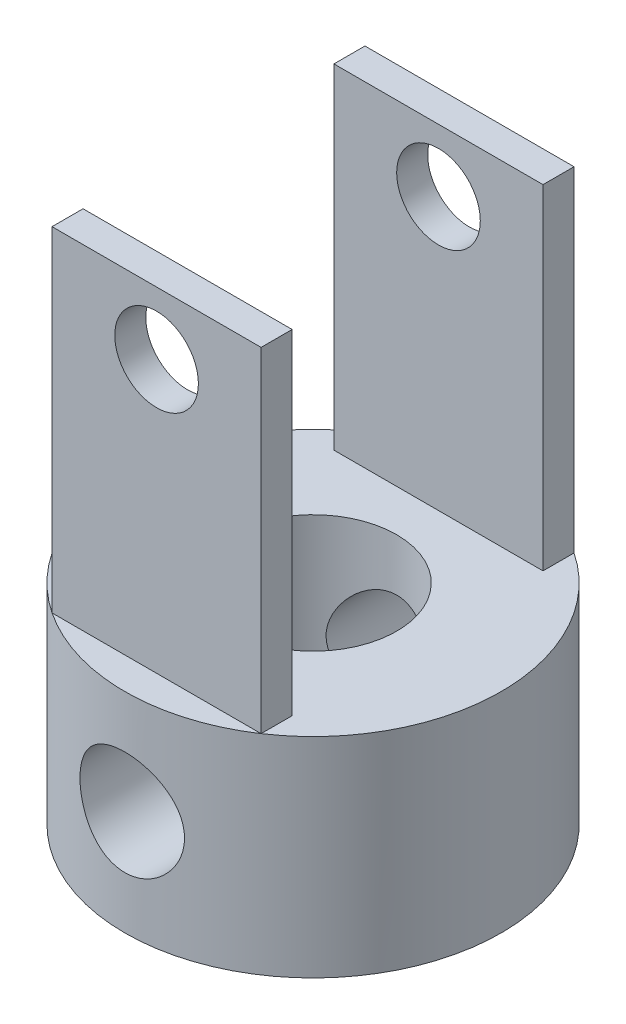
ISO-10303-21;
HEADER;
FILE_DESCRIPTION(('STEP AP214'),'2;1');
FILE_NAME('part.step','',(''),(''),'','','');
FILE_SCHEMA(('AUTOMOTIVE_DESIGN { 1 0 10303 214 1 1 1 1 }'));
ENDSEC;
DATA;
#1=APPLICATION_CONTEXT('core data for automotive mechanical design processes');
#2=APPLICATION_PROTOCOL_DEFINITION('international standard','automotive_design',2000,#1);
#3=PRODUCT_CONTEXT('',#1,'mechanical');
#4=PRODUCT('Part','Part','',(#3));
#5=PRODUCT_RELATED_PRODUCT_CATEGORY('part','',(#4));
#6=PRODUCT_DEFINITION_FORMATION('','',#4);
#7=PRODUCT_DEFINITION_CONTEXT('part definition',#1,'design');
#8=PRODUCT_DEFINITION('design','',#6,#7);
#9=PRODUCT_DEFINITION_SHAPE('','',#8);
#10=(LENGTH_UNIT() NAMED_UNIT(*) SI_UNIT(.MILLI.,.METRE.));
#11=(NAMED_UNIT(*) PLANE_ANGLE_UNIT() SI_UNIT($,.RADIAN.));
#12=(NAMED_UNIT(*) SI_UNIT($,.STERADIAN.) SOLID_ANGLE_UNIT());
#13=UNCERTAINTY_MEASURE_WITH_UNIT(LENGTH_MEASURE(1.E-05),#10,'distance_accuracy_value','');
#14=(GEOMETRIC_REPRESENTATION_CONTEXT(3) GLOBAL_UNCERTAINTY_ASSIGNED_CONTEXT((#13)) GLOBAL_UNIT_ASSIGNED_CONTEXT((#10,
#11,#12)) REPRESENTATION_CONTEXT('',''));
#15=CARTESIAN_POINT('',(0.,0.,0.));
#16=DIRECTION('',(0.,0.,1.));
#17=DIRECTION('',(1.,0.,0.));
#18=AXIS2_PLACEMENT_3D('',#15,#16,#17);
#19=CARTESIAN_POINT('',(0.,5.,0.));
#20=DIRECTION('',(0.,1.,0.));
#21=DIRECTION('',(0.,0.,1.));
#22=AXIS2_PLACEMENT_3D('',#19,#20,#21);
#23=PLANE('',#22);
#24=CARTESIAN_POINT('',(0.,5.,0.));
#25=DIRECTION('',(0.,1.,0.));
#26=DIRECTION('',(0.,0.,1.));
#27=AXIS2_PLACEMENT_3D('',#24,#25,#26);
#28=CIRCLE('',#27,2.);
#29=CARTESIAN_POINT('',(0.,5.,2.));
#30=VERTEX_POINT('',#29);
#31=EDGE_CURVE('E225',#30,#30,#28,.F.);
#32=ORIENTED_EDGE('',*,*,#31,.T.);
#33=EDGE_LOOP('',(#32));
#34=FACE_BOUND('',#33,.T.);
#35=DIRECTION('',(0.,0.,1.));
#36=VECTOR('',#35,1.);
#37=CARTESIAN_POINT('',(-2.5,5.,-3.74165738677394));
#38=LINE('',#37,#36);
#39=CARTESIAN_POINT('',(-2.5,5.,-3.74165738677394));
#40=VERTEX_POINT('',#39);
#41=CARTESIAN_POINT('',(-2.5,5.,-3.));
#42=VERTEX_POINT('',#41);
#43=EDGE_CURVE('E137',#40,#42,#38,.T.);
#44=ORIENTED_EDGE('',*,*,#43,.F.);
#45=CARTESIAN_POINT('',(0.,5.,0.));
#46=DIRECTION('',(0.,1.,0.));
#47=DIRECTION('',(0.,0.,1.));
#48=AXIS2_PLACEMENT_3D('',#45,#46,#47);
#49=CIRCLE('',#48,4.5);
#50=CARTESIAN_POINT('',(-2.5,5.,3.74165738677394));
#51=VERTEX_POINT('',#50);
#52=EDGE_CURVE('E313',#40,#51,#49,.T.);
#53=ORIENTED_EDGE('',*,*,#52,.T.);
#54=DIRECTION('',(0.,0.,1.));
#55=VECTOR('',#54,1.);
#56=CARTESIAN_POINT('',(-2.5,5.,3.74165738677394));
#57=LINE('',#56,#55);
#58=CARTESIAN_POINT('',(-2.5,5.,3.));
#59=VERTEX_POINT('',#58);
#60=EDGE_CURVE('E72',#59,#51,#57,.T.);
#61=ORIENTED_EDGE('',*,*,#60,.F.);
#62=DIRECTION('',(-1.,0.,0.));
#63=VECTOR('',#62,1.);
#64=CARTESIAN_POINT('',(-2.5,5.,3.));
#65=LINE('',#64,#63);
#66=CARTESIAN_POINT('',(2.5,5.,3.));
#67=VERTEX_POINT('',#66);
#68=EDGE_CURVE('E158',#67,#59,#65,.T.);
#69=ORIENTED_EDGE('',*,*,#68,.F.);
#70=DIRECTION('',(0.,0.,-1.));
#71=VECTOR('',#70,1.);
#72=CARTESIAN_POINT('',(2.5,5.,3.74165738677394));
#73=LINE('',#72,#71);
#74=CARTESIAN_POINT('',(2.5,5.,3.74165738677394));
#75=VERTEX_POINT('',#74);
#76=EDGE_CURVE('E160',#75,#67,#73,.T.);
#77=ORIENTED_EDGE('',*,*,#76,.F.);
#78=CARTESIAN_POINT('',(2.5,5.,-3.74165738677394));
#79=VERTEX_POINT('',#78);
#80=EDGE_CURVE('E11',#75,#79,#49,.T.);
#81=ORIENTED_EDGE('',*,*,#80,.T.);
#82=DIRECTION('',(0.,0.,-1.));
#83=VECTOR('',#82,1.);
#84=CARTESIAN_POINT('',(2.5,5.,-3.74165738677394));
#85=LINE('',#84,#83);
#86=CARTESIAN_POINT('',(2.5,5.,-3.));
#87=VERTEX_POINT('',#86);
#88=EDGE_CURVE('E193',#87,#79,#85,.T.);
#89=ORIENTED_EDGE('',*,*,#88,.F.);
#90=DIRECTION('',(1.,0.,0.));
#91=VECTOR('',#90,1.);
#92=CARTESIAN_POINT('',(-2.5,5.,-3.));
#93=LINE('',#92,#91);
#94=EDGE_CURVE('E65',#42,#87,#93,.T.);
#95=ORIENTED_EDGE('',*,*,#94,.F.);
#96=EDGE_LOOP('',(#44,#53,#61,#69,#77,#81,#89,#95));
#97=FACE_BOUND('',#96,.T.);
#98=ADVANCED_FACE('F47',(#34,#97),#23,.T.);
#99=DIRECTION('',(-1.,0.,0.));
#100=VECTOR('',#99,1.);
#101=CARTESIAN_POINT('',(-2.5,5.,-3.74165738677394));
#102=LINE('',#101,#100);
#103=EDGE_CURVE('E134',#79,#40,#102,.T.);
#104=ORIENTED_EDGE('',*,*,#103,.F.);
#105=EDGE_CURVE('E57',#79,#40,#49,.T.);
#106=ORIENTED_EDGE('',*,*,#105,.T.);
#107=EDGE_LOOP('',(#104,#106));
#108=FACE_BOUND('',#107,.T.);
#109=ADVANCED_FACE('F290',(#108),#23,.T.);
#110=CARTESIAN_POINT('',(0.,5.,0.));
#111=DIRECTION('',(0.,-1.,0.));
#112=DIRECTION('',(0.,0.,-1.));
#113=AXIS2_PLACEMENT_3D('',#110,#111,#112);
#114=CYLINDRICAL_SURFACE('',#113,4.5);
#115=CARTESIAN_POINT('',(0.,3.75,-4.5));
#116=CARTESIAN_POINT('',(-0.0688012508831791,3.74999860041477,-4.49999908016929));
#117=CARTESIAN_POINT('',(-0.137617123752667,3.74430068019471,-4.49840674086833));
#118=CARTESIAN_POINT('',(-0.273259475994238,3.72170427173468,-4.49220950198236));
#119=CARTESIAN_POINT('',(-0.340085103663439,3.70480105828628,-4.48760333149253));
#120=CARTESIAN_POINT('',(-0.469769949680301,3.66039128058608,-4.47588565394594));
#121=CARTESIAN_POINT('',(-0.53263439009567,3.63289903130159,-4.46877753030964));
#122=CARTESIAN_POINT('',(-0.652860695241772,3.56814649367313,-4.45280312581996));
#123=CARTESIAN_POINT('',(-0.710222070812297,3.53088533808074,-4.44393668888688));
#124=CARTESIAN_POINT('',(-0.819246784715924,3.44667056615714,-4.4251515781749));
#125=CARTESIAN_POINT('',(-0.870753112808474,3.39951796031246,-4.41521373623696));
#126=CARTESIAN_POINT('',(-0.965238185696338,3.29728372287841,-4.39552607117256));
#127=CARTESIAN_POINT('',(-1.00821573084554,3.24220097772477,-4.38577627467018));
#128=CARTESIAN_POINT('',(-1.08520808580323,3.12439273987068,-4.36737044294547));
#129=CARTESIAN_POINT('',(-1.11903874947837,3.06154279155628,-4.35873847945984));
#130=CARTESIAN_POINT('',(-1.1755895713114,2.93076808235988,-4.34382900808304));
#131=CARTESIAN_POINT('',(-1.19831197336242,2.86284434959184,-4.33755102474248));
#132=CARTESIAN_POINT('',(-1.23144924367956,2.72559721114588,-4.32825883142877));
#133=CARTESIAN_POINT('',(-1.24215036904296,2.65634817836012,-4.32516886003198));
#134=CARTESIAN_POINT('',(-1.25183427077972,2.51697411443717,-4.32237649384804));
#135=CARTESIAN_POINT('',(-1.25081944027303,2.4468492651188,-4.3226734072502));
#136=CARTESIAN_POINT('',(-1.2373267133762,2.30997772127729,-4.32655366801453));
#137=CARTESIAN_POINT('',(-1.22519902270671,2.24319319850379,-4.33003660668585));
#138=CARTESIAN_POINT('',(-1.19038731201905,2.11264637140841,-4.33973517053475));
#139=CARTESIAN_POINT('',(-1.16770238457158,2.04888432739775,-4.3459510306134));
#140=CARTESIAN_POINT('',(-1.11214373134465,1.92529776854472,-4.36050069775752));
#141=CARTESIAN_POINT('',(-1.07915021836991,1.86553013318995,-4.36885918600197));
#142=CARTESIAN_POINT('',(-1.00399440679635,1.75225842440876,-4.386739506843));
#143=CARTESIAN_POINT('',(-0.961830166290601,1.69875568127386,-4.39626158564316));
#144=CARTESIAN_POINT('',(-0.86775561028444,1.59753611956358,-4.41581072126827));
#145=CARTESIAN_POINT('',(-0.815552279702356,1.55009236512015,-4.42584370037791));
#146=CARTESIAN_POINT('',(-0.703806607201035,1.46457426922219,-4.44498199810829));
#147=CARTESIAN_POINT('',(-0.644263925421965,1.42650036189752,-4.45408727373461));
#148=CARTESIAN_POINT('',(-0.519083429338114,1.36066818436993,-4.47040839712755));
#149=CARTESIAN_POINT('',(-0.453416395747747,1.3329628960611,-4.47761448645532));
#150=CARTESIAN_POINT('',(-0.318109988769714,1.28906590155863,-4.48925492501446));
#151=CARTESIAN_POINT('',(-0.24847156412113,1.27287145784343,-4.493689933237));
#152=CARTESIAN_POINT('',(-0.109526607713142,1.25289286322103,-4.49918736483408));
#153=CARTESIAN_POINT('',(-0.0402773058586808,1.24873785509283,-4.5003505382403));
#154=CARTESIAN_POINT('',(0.0979299306365675,1.25192699829243,-4.49946480293159));
#155=CARTESIAN_POINT('',(0.166887897284519,1.25926985164805,-4.49741625678167));
#156=CARTESIAN_POINT('',(0.301206913470861,1.28494333411964,-4.49040265059029));
#157=CARTESIAN_POINT('',(0.366611288163868,1.30306394505752,-4.4854933716758));
#158=CARTESIAN_POINT('',(0.493443118118722,1.3495318676381,-4.47331829169354));
#159=CARTESIAN_POINT('',(0.554870123972382,1.37788033256951,-4.46605222488463));
#160=CARTESIAN_POINT('',(0.673420140405416,1.4446658780465,-4.44973740284175));
#161=CARTESIAN_POINT('',(0.730427061953541,1.48330052432267,-4.44065471340565));
#162=CARTESIAN_POINT('',(0.837277670587,1.56931613580746,-4.42175477128212));
#163=CARTESIAN_POINT('',(0.887119814631375,1.61669898006576,-4.41193736105189));
#164=CARTESIAN_POINT('',(0.979812026944951,1.72060144387835,-4.39229842684379));
#165=CARTESIAN_POINT('',(1.02239957885383,1.77735745155757,-4.3824860820796));
#166=CARTESIAN_POINT('',(1.09745581429008,1.89742063787973,-4.36429693304267));
#167=CARTESIAN_POINT('',(1.12992488482463,1.9607275658426,-4.35592007387163));
#168=CARTESIAN_POINT('',(1.18358105834153,2.09180716988317,-4.34164798956173));
#169=CARTESIAN_POINT('',(1.20483077484783,2.15955263775464,-4.3357390309604));
#170=CARTESIAN_POINT('',(1.23557652495357,2.29784970941676,-4.32707876892783));
#171=CARTESIAN_POINT('',(1.24507587906573,2.36840051463312,-4.32432657344887));
#172=CARTESIAN_POINT('',(1.25184859974321,2.50760577949078,-4.32237038329875));
#173=CARTESIAN_POINT('',(1.24954571014582,2.57623819001194,-4.32304340461176));
#174=CARTESIAN_POINT('',(1.23377143287258,2.71209489379468,-4.32757137052124));
#175=CARTESIAN_POINT('',(1.2203003804941,2.77931922926824,-4.33142621959091));
#176=CARTESIAN_POINT('',(1.18282724248614,2.90986723391807,-4.34180718808003));
#177=CARTESIAN_POINT('',(1.15892214641117,2.97322084264776,-4.34830866913275));
#178=CARTESIAN_POINT('',(1.10133451670734,3.09506742250732,-4.36324916052054));
#179=CARTESIAN_POINT('',(1.06765033358688,3.15355957148569,-4.37168849767404));
#180=CARTESIAN_POINT('',(0.990206962020971,3.26602765282517,-4.38988810785379));
#181=CARTESIAN_POINT('',(0.946162084346266,3.31980147668272,-4.39968178982262));
#182=CARTESIAN_POINT('',(0.849781527450663,3.41933237205346,-4.41930831909362));
#183=CARTESIAN_POINT('',(0.797443795628191,3.46508745289098,-4.4291411755031));
#184=CARTESIAN_POINT('',(0.684460232307881,3.54835813657808,-4.44801839581548));
#185=CARTESIAN_POINT('',(0.623646258932174,3.58565162331068,-4.45703841192792));
#186=CARTESIAN_POINT('',(0.496361982692841,3.64942813928948,-4.47299974900605));
#187=CARTESIAN_POINT('',(0.429895030176724,3.67591751858102,-4.47994229035336));
#188=CARTESIAN_POINT('',(0.3031454837667,3.7142200807347,-4.4901607483195));
#189=CARTESIAN_POINT('',(0.243364402168741,3.72760478759287,-4.49382245661855));
#190=CARTESIAN_POINT('',(0.122392625693409,3.74549484582254,-4.49874234976285));
#191=CARTESIAN_POINT('',(0.0612020980194152,3.75000124499993,-4.50000081823467));
#192=CARTESIAN_POINT('',(0.,3.75,-4.5));
#193=B_SPLINE_CURVE_WITH_KNOTS('',3,(#115,#116,#117,#118,#119,#120,#121,#122,#123,#124,#125,
#126,#127,#128,#129,#130,#131,#132,#133,#134,#135,#136,#137,#138,#139,#140,#141,#142,#143,#144,
#145,#146,#147,#148,#149,#150,#151,#152,#153,#154,#155,#156,#157,#158,#159,#160,#161,#162,#163,
#164,#165,#166,#167,#168,#169,#170,#171,#172,#173,#174,#175,#176,#177,#178,#179,#180,#181,#182,
#183,#184,#185,#186,#187,#188,#189,#190,#191,#192),.UNSPECIFIED.,.T.,.F.,(4,2,2,2,2,2,2,2,2,2,2,
2,2,2,2,2,2,2,2,2,2,2,2,2,2,2,2,2,2,2,2,2,2,2,2,2,2,2,4),(0.,0.20617919309949,0.412445386147261,
0.618433707942854,0.824440322837931,1.03507624325264,1.24574177043995,1.46037690323672,
1.67496866133384,1.88433431939189,2.09365721284144,2.29660232990422,2.49956489399153,
2.70497960040655,2.91043784592675,3.12319493838161,3.33596188658146,3.54980165635949,
3.76359055350007,3.97072010588426,4.17782627748477,4.38102317477486,4.58424299163038,
4.79168948884226,4.99918059600964,5.21305991702851,5.426931056682,5.63959564853972,
5.85220013017267,6.05722599244308,6.26224569952548,6.46539893556025,6.66858645848128,
6.8782191327377,7.0879037754062,7.30258090584732,7.51713167871718,7.70055986525029,
7.88396640253934),.UNSPECIFIED.);
#194=CARTESIAN_POINT('',(0.,3.75,-4.5));
#195=VERTEX_POINT('',#194);
#196=EDGE_CURVE('E320',#195,#195,#193,.T.);
#197=ORIENTED_EDGE('',*,*,#196,.T.);
#198=EDGE_LOOP('',(#197));
#199=FACE_BOUND('',#198,.T.);
#200=CARTESIAN_POINT('',(1.25,2.5,4.32290411644765));
#201=CARTESIAN_POINT('',(1.24999857498244,2.43125652335593,4.32290518747009));
#202=CARTESIAN_POINT('',(1.24430988712604,2.36249837996371,4.32456180468303));
#203=CARTESIAN_POINT('',(1.22175346858591,2.22697570228416,4.33098737036507));
#204=CARTESIAN_POINT('',(1.20488074482037,2.1602120723611,4.3357577089319));
#205=CARTESIAN_POINT('',(1.16056004340388,2.03065883662032,4.34782967711429));
#206=CARTESIAN_POINT('',(1.13312779872145,1.96786347962317,4.35512753927727));
#207=CARTESIAN_POINT('',(1.06851688708743,1.84775453897228,4.37142737531087));
#208=CARTESIAN_POINT('',(1.03133723028468,1.79044151285728,4.38042952222604));
#209=CARTESIAN_POINT('',(0.947207659537757,1.68136907220858,4.39939741122667));
#210=CARTESIAN_POINT('',(0.900040389354681,1.62978044118192,4.40938137769938));
#211=CARTESIAN_POINT('',(0.797741434800139,1.53513458048033,4.42903119907275));
#212=CARTESIAN_POINT('',(0.74260886547861,1.4920783000175,4.43869701848036));
#213=CARTESIAN_POINT('',(0.624750214452997,1.41499776941939,4.45682601370986));
#214=CARTESIAN_POINT('',(0.561908163805416,1.3811447040778,4.46526519213644));
#215=CARTESIAN_POINT('',(0.431150181024712,1.32455036312015,4.47978009156482));
#216=CARTESIAN_POINT('',(0.363235182945446,1.30180704771302,4.48585624638467));
#217=CARTESIAN_POINT('',(0.226043180102931,1.26863452726371,4.49483159170207));
#218=CARTESIAN_POINT('',(0.156841487533508,1.25791447886935,4.49780569025352));
#219=CARTESIAN_POINT('',(0.0175622284393639,1.24817627167198,4.50050433692141));
#220=CARTESIAN_POINT('',(-0.0525151772113885,1.24915599422164,4.50022947337466));
#221=CARTESIAN_POINT('',(-0.189527123576272,1.26258777619191,4.49651543187109));
#222=CARTESIAN_POINT('',(-0.256495205022549,1.27472538198454,4.49316299037632));
#223=CARTESIAN_POINT('',(-0.38740374166124,1.30961856911628,4.48377380049515));
#224=CARTESIAN_POINT('',(-0.451344017003044,1.33237478032754,4.47773689287315));
#225=CARTESIAN_POINT('',(-0.575166795899741,1.38809104029157,4.46353125303123));
#226=CARTESIAN_POINT('',(-0.634999513293939,1.42115595476214,4.45534075392173));
#227=CARTESIAN_POINT('',(-0.748372286544129,1.49646980790988,4.43770610675039));
#228=CARTESIAN_POINT('',(-0.801911023420063,1.53872066634598,4.42826169679617));
#229=CARTESIAN_POINT('',(-0.903053380191149,1.63286432888863,4.40876831613152));
#230=CARTESIAN_POINT('',(-0.950400625294905,1.6850309028229,4.39870968477246));
#231=CARTESIAN_POINT('',(-1.03574054042556,1.79666633756107,4.37940191575936));
#232=CARTESIAN_POINT('',(-1.07373253513777,1.85613572505908,4.37015283657441));
#233=CARTESIAN_POINT('',(-1.13950119060979,1.98128236070626,4.35347006971972));
#234=CARTESIAN_POINT('',(-1.16720250820497,2.04700113465338,4.34604990034145));
#235=CARTESIAN_POINT('',(-1.21107648821783,2.18242179787883,4.33403011245413));
#236=CARTESIAN_POINT('',(-1.22725229229959,2.25212259612334,4.32942972536695));
#237=CARTESIAN_POINT('',(-1.2471622774305,2.39111725699411,4.3237357416584));
#238=CARTESIAN_POINT('',(-1.25128124671117,2.46035161739731,4.32253373160699));
#239=CARTESIAN_POINT('',(-1.24802546030741,2.59852099522208,4.32347494363827));
#240=CARTESIAN_POINT('',(-1.24065204762324,2.66745604667692,4.3256177748427));
#241=CARTESIAN_POINT('',(-1.21496120714199,2.80154887335,4.33290194955527));
#242=CARTESIAN_POINT('',(-1.19688029932166,2.86675583442476,4.33797843412407));
#243=CARTESIAN_POINT('',(-1.15055629594164,2.99321011354927,4.35049332079077));
#244=CARTESIAN_POINT('',(-1.12231179178945,3.05445688135949,4.35793205025995));
#245=CARTESIAN_POINT('',(-1.05569785607915,3.17284768427921,4.3745518120738));
#246=CARTESIAN_POINT('',(-1.01710533632441,3.22986088551919,4.38376979927329));
#247=CARTESIAN_POINT('',(-0.931163609237379,3.33674312203778,4.40282499705416));
#248=CARTESIAN_POINT('',(-0.883812610803321,3.38661069233221,4.41266233402014));
#249=CARTESIAN_POINT('',(-0.779908718233593,3.47941073528424,4.43222509969555));
#250=CARTESIAN_POINT('',(-0.723111799354903,3.52207340503389,4.44193710647942));
#251=CARTESIAN_POINT('',(-0.602941556434743,3.59726198553872,4.45983701439328));
#252=CARTESIAN_POINT('',(-0.539568581085917,3.62978843339709,4.46802499626981));
#253=CARTESIAN_POINT('',(-0.408489197616628,3.6834747959117,4.48190163893738));
#254=CARTESIAN_POINT('',(-0.340820050525332,3.70472058303361,4.48760911989691));
#255=CARTESIAN_POINT('',(-0.202688156447679,3.73548408672038,4.49596471419449));
#256=CARTESIAN_POINT('',(-0.132226089798137,3.74500464157181,4.49861356791422));
#257=CARTESIAN_POINT('',(0.0069800761788269,3.75185716484314,4.50051521104671));
#258=CARTESIAN_POINT('',(0.075703532294838,3.74958335354531,4.49987784493188));
#259=CARTESIAN_POINT('',(0.211750309863845,3.73383571875471,4.49553044423232));
#260=CARTESIAN_POINT('',(0.279073691936855,3.7203623812151,4.49182054296648));
#261=CARTESIAN_POINT('',(0.409892491734703,3.68282838818581,4.48176992045676));
#262=CARTESIAN_POINT('',(0.473414328140757,3.6588537010331,4.47545058468407));
#263=CARTESIAN_POINT('',(0.59556960394138,3.6010740308847,4.46083910148551));
#264=CARTESIAN_POINT('',(0.654202313356983,3.56726758331173,4.45254666017165));
#265=CARTESIAN_POINT('',(0.766725560865268,3.4896640286411,4.43457698674557));
#266=CARTESIAN_POINT('',(0.820433633237658,3.44560995696169,4.424867058695));
#267=CARTESIAN_POINT('',(0.919827817865878,3.34924103477822,4.40527960400557));
#268=CARTESIAN_POINT('',(0.965511754330254,3.29692395099116,4.39540203270303));
#269=CARTESIAN_POINT('',(1.04867120954826,3.18397774126432,4.37631776775268));
#270=CARTESIAN_POINT('',(1.08591898377728,3.12317680517996,4.36713335303392));
#271=CARTESIAN_POINT('',(1.14961326326322,2.99592800635586,4.35080192911572));
#272=CARTESIAN_POINT('',(1.17606625417817,2.92948356339495,4.3436536973308));
#273=CARTESIAN_POINT('',(1.21429747440485,2.80281993514138,4.33310672877768));
#274=CARTESIAN_POINT('',(1.22765281702807,2.74310529722462,4.32931330336832));
#275=CARTESIAN_POINT('',(1.2455041024603,2.62226417588502,4.32421169234928));
#276=CARTESIAN_POINT('',(1.25000126735755,2.56113788839299,4.32290316392016));
#277=CARTESIAN_POINT('',(1.25,2.5,4.32290411644765));
#278=B_SPLINE_CURVE_WITH_KNOTS('',3,(#200,#201,#202,#203,#204,#205,#206,#207,#208,#209,#210,
#211,#212,#213,#214,#215,#216,#217,#218,#219,#220,#221,#222,#223,#224,#225,#226,#227,#228,#229,
#230,#231,#232,#233,#234,#235,#236,#237,#238,#239,#240,#241,#242,#243,#244,#245,#246,#247,#248,
#249,#250,#251,#252,#253,#254,#255,#256,#257,#258,#259,#260,#261,#262,#263,#264,#265,#266,#267,
#268,#269,#270,#271,#272,#273,#274,#275,#276,#277),.UNSPECIFIED.,.T.,.F.,(4,2,2,2,2,2,2,2,2,2,2,
2,2,2,2,2,2,2,2,2,2,2,2,2,2,2,2,2,2,2,2,2,2,2,2,2,2,2,4),(0.,0.20600539584448,0.412102824227257,
0.617894362639286,0.823706807313081,1.03456947880015,1.24545559531203,1.46003098375315,
1.67456696053961,1.8837931561237,2.09298146465861,2.29644933759041,2.49992928132028,
2.70555066651715,2.91121506564783,3.12371437775741,3.336229024771,3.55027028703842,
3.76425318285945,3.97132818882307,4.17837899780676,4.38101838846584,4.58368587413355,
4.79113333818944,4.99862327207956,5.2126875312967,5.42674044564049,5.63913966265412,
5.85148745480915,6.05678432365223,6.26207228502411,6.46571019932815,6.66937846387956,
6.87884344725019,7.08836514088847,7.30300439729128,7.51751450485885,7.70075331478743,
7.88396684302815),.UNSPECIFIED.);
#279=CARTESIAN_POINT('',(1.25,2.5,4.32290411644765));
#280=VERTEX_POINT('',#279);
#281=EDGE_CURVE('E231',#280,#280,#278,.T.);
#282=ORIENTED_EDGE('',*,*,#281,.T.);
#283=EDGE_LOOP('',(#282));
#284=FACE_BOUND('',#283,.T.);
#285=ORIENTED_EDGE('',*,*,#80,.F.);
#286=EDGE_CURVE('E58',#51,#75,#49,.T.);
#287=ORIENTED_EDGE('',*,*,#286,.F.);
#288=ORIENTED_EDGE('',*,*,#52,.F.);
#289=ORIENTED_EDGE('',*,*,#105,.F.);
#290=EDGE_LOOP('',(#285,#287,#288,#289));
#291=FACE_BOUND('',#290,.T.);
#292=CARTESIAN_POINT('',(0.,0.,0.));
#293=DIRECTION('',(0.,1.,0.));
#294=DIRECTION('',(0.,0.,1.));
#295=AXIS2_PLACEMENT_3D('',#292,#293,#294);
#296=CIRCLE('',#295,4.5);
#297=CARTESIAN_POINT('',(0.,0.,4.5));
#298=VERTEX_POINT('',#297);
#299=EDGE_CURVE('E52',#298,#298,#296,.T.);
#300=ORIENTED_EDGE('',*,*,#299,.T.);
#301=EDGE_LOOP('',(#300));
#302=FACE_BOUND('',#301,.T.);
#303=ADVANCED_FACE('F49',(#199,#284,#291,#302),#114,.T.);
#304=DIRECTION('',(1.,0.,0.));
#305=VECTOR('',#304,1.);
#306=CARTESIAN_POINT('',(-2.5,5.,3.74165738677394));
#307=LINE('',#306,#305);
#308=EDGE_CURVE('E164',#51,#75,#307,.T.);
#309=ORIENTED_EDGE('',*,*,#308,.F.);
#310=ORIENTED_EDGE('',*,*,#286,.T.);
#311=EDGE_LOOP('',(#309,#310));
#312=FACE_BOUND('',#311,.T.);
#313=ADVANCED_FACE('F287',(#312),#23,.T.);
#314=CARTESIAN_POINT('',(0.,0.,0.));
#315=DIRECTION('',(0.,1.,0.));
#316=DIRECTION('',(0.,0.,1.));
#317=AXIS2_PLACEMENT_3D('',#314,#315,#316);
#318=PLANE('',#317);
#319=CARTESIAN_POINT('',(0.,0.,0.));
#320=DIRECTION('',(0.,-1.,0.));
#321=DIRECTION('',(0.,0.,-1.));
#322=AXIS2_PLACEMENT_3D('',#319,#320,#321);
#323=CIRCLE('',#322,2.);
#324=CARTESIAN_POINT('',(0.,0.,-2.));
#325=VERTEX_POINT('',#324);
#326=EDGE_CURVE('E228',#325,#325,#323,.T.);
#327=ORIENTED_EDGE('',*,*,#326,.F.);
#328=EDGE_LOOP('',(#327));
#329=FACE_BOUND('',#328,.T.);
#330=ORIENTED_EDGE('',*,*,#299,.F.);
#331=EDGE_LOOP('',(#330));
#332=FACE_BOUND('',#331,.T.);
#333=ADVANCED_FACE('F276',(#329,#332),#318,.F.);
#334=CARTESIAN_POINT('',(-2.5,13.,3.74165738677394));
#335=DIRECTION('',(1.,0.,0.));
#336=DIRECTION('',(0.,0.,-1.));
#337=AXIS2_PLACEMENT_3D('',#334,#335,#336);
#338=PLANE('',#337);
#339=ORIENTED_EDGE('',*,*,#60,.T.);
#340=DIRECTION('',(0.,-1.,0.));
#341=VECTOR('',#340,1.);
#342=CARTESIAN_POINT('',(-2.5,13.,3.74165738677394));
#343=LINE('',#342,#341);
#344=CARTESIAN_POINT('',(-2.5,13.,3.74165738677394));
#345=VERTEX_POINT('',#344);
#346=EDGE_CURVE('E144',#345,#51,#343,.T.);
#347=ORIENTED_EDGE('',*,*,#346,.F.);
#348=DIRECTION('',(0.,0.,1.));
#349=VECTOR('',#348,1.);
#350=CARTESIAN_POINT('',(-2.5,13.,3.74165738677394));
#351=LINE('',#350,#349);
#352=CARTESIAN_POINT('',(-2.5,13.,3.));
#353=VERTEX_POINT('',#352);
#354=EDGE_CURVE('E161',#353,#345,#351,.T.);
#355=ORIENTED_EDGE('',*,*,#354,.F.);
#356=DIRECTION('',(0.,-1.,0.));
#357=VECTOR('',#356,1.);
#358=CARTESIAN_POINT('',(-2.5,13.,3.));
#359=LINE('',#358,#357);
#360=EDGE_CURVE('E154',#353,#59,#359,.T.);
#361=ORIENTED_EDGE('',*,*,#360,.T.);
#362=EDGE_LOOP('',(#339,#347,#355,#361));
#363=FACE_BOUND('',#362,.T.);
#364=ADVANCED_FACE('F182',(#363),#338,.F.);
#365=CARTESIAN_POINT('',(-2.5,13.,3.74165738677394));
#366=DIRECTION('',(0.,0.,-1.));
#367=DIRECTION('',(-1.,0.,0.));
#368=AXIS2_PLACEMENT_3D('',#365,#366,#367);
#369=PLANE('',#368);
#370=CARTESIAN_POINT('',(0.,11.5,3.74165738677394));
#371=DIRECTION('',(0.,0.,1.));
#372=DIRECTION('',(1.,0.,0.));
#373=AXIS2_PLACEMENT_3D('',#370,#371,#372);
#374=CIRCLE('',#373,1.);
#375=CARTESIAN_POINT('',(1.,11.5,3.74165738677394));
#376=VERTEX_POINT('',#375);
#377=EDGE_CURVE('E222',#376,#376,#374,.T.);
#378=ORIENTED_EDGE('',*,*,#377,.F.);
#379=EDGE_LOOP('',(#378));
#380=FACE_BOUND('',#379,.T.);
#381=ORIENTED_EDGE('',*,*,#308,.T.);
#382=DIRECTION('',(0.,-1.,0.));
#383=VECTOR('',#382,1.);
#384=CARTESIAN_POINT('',(2.5,13.,3.74165738677394));
#385=LINE('',#384,#383);
#386=CARTESIAN_POINT('',(2.5,13.,3.74165738677394));
#387=VERTEX_POINT('',#386);
#388=EDGE_CURVE('E147',#387,#75,#385,.T.);
#389=ORIENTED_EDGE('',*,*,#388,.F.);
#390=DIRECTION('',(1.,0.,0.));
#391=VECTOR('',#390,1.);
#392=CARTESIAN_POINT('',(-2.5,13.,3.74165738677394));
#393=LINE('',#392,#391);
#394=EDGE_CURVE('E171',#345,#387,#393,.T.);
#395=ORIENTED_EDGE('',*,*,#394,.F.);
#396=ORIENTED_EDGE('',*,*,#346,.T.);
#397=EDGE_LOOP('',(#381,#389,#395,#396));
#398=FACE_BOUND('',#397,.T.);
#399=ADVANCED_FACE('F184',(#380,#398),#369,.F.);
#400=CARTESIAN_POINT('',(2.5,13.,3.74165738677394));
#401=DIRECTION('',(-1.,0.,0.));
#402=DIRECTION('',(0.,0.,1.));
#403=AXIS2_PLACEMENT_3D('',#400,#401,#402);
#404=PLANE('',#403);
#405=ORIENTED_EDGE('',*,*,#76,.T.);
#406=DIRECTION('',(0.,-1.,0.));
#407=VECTOR('',#406,1.);
#408=CARTESIAN_POINT('',(2.5,13.,3.));
#409=LINE('',#408,#407);
#410=CARTESIAN_POINT('',(2.5,13.,3.));
#411=VERTEX_POINT('',#410);
#412=EDGE_CURVE('E151',#411,#67,#409,.T.);
#413=ORIENTED_EDGE('',*,*,#412,.F.);
#414=DIRECTION('',(0.,0.,-1.));
#415=VECTOR('',#414,1.);
#416=CARTESIAN_POINT('',(2.5,13.,3.74165738677394));
#417=LINE('',#416,#415);
#418=EDGE_CURVE('E169',#387,#411,#417,.T.);
#419=ORIENTED_EDGE('',*,*,#418,.F.);
#420=ORIENTED_EDGE('',*,*,#388,.T.);
#421=EDGE_LOOP('',(#405,#413,#419,#420));
#422=FACE_BOUND('',#421,.T.);
#423=ADVANCED_FACE('F188',(#422),#404,.F.);
#424=CARTESIAN_POINT('',(-2.5,13.,3.));
#425=DIRECTION('',(0.,0.,1.));
#426=DIRECTION('',(1.,0.,0.));
#427=AXIS2_PLACEMENT_3D('',#424,#425,#426);
#428=PLANE('',#427);
#429=CARTESIAN_POINT('',(0.,11.5,3.));
#430=DIRECTION('',(0.,0.,1.));
#431=DIRECTION('',(1.,0.,0.));
#432=AXIS2_PLACEMENT_3D('',#429,#430,#431);
#433=CIRCLE('',#432,1.);
#434=CARTESIAN_POINT('',(1.,11.5,3.));
#435=VERTEX_POINT('',#434);
#436=EDGE_CURVE('E148',#435,#435,#433,.T.);
#437=ORIENTED_EDGE('',*,*,#436,.T.);
#438=EDGE_LOOP('',(#437));
#439=FACE_BOUND('',#438,.T.);
#440=ORIENTED_EDGE('',*,*,#68,.T.);
#441=ORIENTED_EDGE('',*,*,#360,.F.);
#442=DIRECTION('',(-1.,0.,0.));
#443=VECTOR('',#442,1.);
#444=CARTESIAN_POINT('',(-2.5,13.,3.));
#445=LINE('',#444,#443);
#446=EDGE_CURVE('E157',#411,#353,#445,.T.);
#447=ORIENTED_EDGE('',*,*,#446,.F.);
#448=ORIENTED_EDGE('',*,*,#412,.T.);
#449=EDGE_LOOP('',(#440,#441,#447,#448));
#450=FACE_BOUND('',#449,.T.);
#451=ADVANCED_FACE('F191',(#439,#450),#428,.F.);
#452=CARTESIAN_POINT('',(0.,13.,0.));
#453=DIRECTION('',(0.,-1.,0.));
#454=DIRECTION('',(0.,0.,-1.));
#455=AXIS2_PLACEMENT_3D('',#452,#453,#454);
#456=PLANE('',#455);
#457=ORIENTED_EDGE('',*,*,#354,.T.);
#458=ORIENTED_EDGE('',*,*,#394,.T.);
#459=ORIENTED_EDGE('',*,*,#418,.T.);
#460=ORIENTED_EDGE('',*,*,#446,.T.);
#461=EDGE_LOOP('',(#457,#458,#459,#460));
#462=FACE_BOUND('',#461,.T.);
#463=ADVANCED_FACE('F177',(#462),#456,.F.);
#464=CARTESIAN_POINT('',(-2.5,13.,-3.74165738677394));
#465=DIRECTION('',(1.,0.,0.));
#466=DIRECTION('',(0.,0.,-1.));
#467=AXIS2_PLACEMENT_3D('',#464,#465,#466);
#468=PLANE('',#467);
#469=ORIENTED_EDGE('',*,*,#43,.T.);
#470=DIRECTION('',(0.,-1.,0.));
#471=VECTOR('',#470,1.);
#472=CARTESIAN_POINT('',(-2.5,13.,-3.));
#473=LINE('',#472,#471);
#474=CARTESIAN_POINT('',(-2.5,13.,-3.));
#475=VERTEX_POINT('',#474);
#476=EDGE_CURVE('E118',#475,#42,#473,.T.);
#477=ORIENTED_EDGE('',*,*,#476,.F.);
#478=DIRECTION('',(0.,0.,1.));
#479=VECTOR('',#478,1.);
#480=CARTESIAN_POINT('',(-2.5,13.,-3.74165738677394));
#481=LINE('',#480,#479);
#482=CARTESIAN_POINT('',(-2.5,13.,-3.74165738677394));
#483=VERTEX_POINT('',#482);
#484=EDGE_CURVE('E125',#483,#475,#481,.T.);
#485=ORIENTED_EDGE('',*,*,#484,.F.);
#486=DIRECTION('',(0.,-1.,0.));
#487=VECTOR('',#486,1.);
#488=CARTESIAN_POINT('',(-2.5,13.,-3.74165738677394));
#489=LINE('',#488,#487);
#490=EDGE_CURVE('E206',#483,#40,#489,.T.);
#491=ORIENTED_EDGE('',*,*,#490,.T.);
#492=EDGE_LOOP('',(#469,#477,#485,#491));
#493=FACE_BOUND('',#492,.T.);
#494=ADVANCED_FACE('F136',(#493),#468,.F.);
#495=CARTESIAN_POINT('',(-2.5,13.,-3.));
#496=DIRECTION('',(0.,0.,-1.));
#497=DIRECTION('',(-1.,0.,0.));
#498=AXIS2_PLACEMENT_3D('',#495,#496,#497);
#499=PLANE('',#498);
#500=CARTESIAN_POINT('',(0.,11.5,-3.));
#501=DIRECTION('',(0.,0.,-1.));
#502=DIRECTION('',(-1.,0.,0.));
#503=AXIS2_PLACEMENT_3D('',#500,#501,#502);
#504=CIRCLE('',#503,1.);
#505=CARTESIAN_POINT('',(-1.,11.5,-3.));
#506=VERTEX_POINT('',#505);
#507=EDGE_CURVE('E216',#506,#506,#504,.T.);
#508=ORIENTED_EDGE('',*,*,#507,.T.);
#509=EDGE_LOOP('',(#508));
#510=FACE_BOUND('',#509,.T.);
#511=ORIENTED_EDGE('',*,*,#94,.T.);
#512=DIRECTION('',(0.,-1.,0.));
#513=VECTOR('',#512,1.);
#514=CARTESIAN_POINT('',(2.5,13.,-3.));
#515=LINE('',#514,#513);
#516=CARTESIAN_POINT('',(2.5,13.,-3.));
#517=VERTEX_POINT('',#516);
#518=EDGE_CURVE('E121',#517,#87,#515,.T.);
#519=ORIENTED_EDGE('',*,*,#518,.F.);
#520=DIRECTION('',(1.,0.,0.));
#521=VECTOR('',#520,1.);
#522=CARTESIAN_POINT('',(-2.5,13.,-3.));
#523=LINE('',#522,#521);
#524=EDGE_CURVE('E114',#475,#517,#523,.T.);
#525=ORIENTED_EDGE('',*,*,#524,.F.);
#526=ORIENTED_EDGE('',*,*,#476,.T.);
#527=EDGE_LOOP('',(#511,#519,#525,#526));
#528=FACE_BOUND('',#527,.T.);
#529=ADVANCED_FACE('F116',(#510,#528),#499,.F.);
#530=CARTESIAN_POINT('',(2.5,13.,-3.74165738677394));
#531=DIRECTION('',(-1.,0.,0.));
#532=DIRECTION('',(0.,0.,1.));
#533=AXIS2_PLACEMENT_3D('',#530,#531,#532);
#534=PLANE('',#533);
#535=ORIENTED_EDGE('',*,*,#88,.T.);
#536=DIRECTION('',(0.,-1.,0.));
#537=VECTOR('',#536,1.);
#538=CARTESIAN_POINT('',(2.5,13.,-3.74165738677394));
#539=LINE('',#538,#537);
#540=CARTESIAN_POINT('',(2.5,13.,-3.74165738677394));
#541=VERTEX_POINT('',#540);
#542=EDGE_CURVE('E140',#541,#79,#539,.T.);
#543=ORIENTED_EDGE('',*,*,#542,.F.);
#544=DIRECTION('',(0.,0.,-1.));
#545=VECTOR('',#544,1.);
#546=CARTESIAN_POINT('',(2.5,13.,-3.74165738677394));
#547=LINE('',#546,#545);
#548=EDGE_CURVE('E124',#517,#541,#547,.T.);
#549=ORIENTED_EDGE('',*,*,#548,.F.);
#550=ORIENTED_EDGE('',*,*,#518,.T.);
#551=EDGE_LOOP('',(#535,#543,#549,#550));
#552=FACE_BOUND('',#551,.T.);
#553=ADVANCED_FACE('F201',(#552),#534,.F.);
#554=CARTESIAN_POINT('',(-2.5,13.,-3.74165738677394));
#555=DIRECTION('',(0.,0.,1.));
#556=DIRECTION('',(1.,0.,0.));
#557=AXIS2_PLACEMENT_3D('',#554,#555,#556);
#558=PLANE('',#557);
#559=CARTESIAN_POINT('',(0.,11.5,-3.74165738677394));
#560=DIRECTION('',(0.,0.,1.));
#561=DIRECTION('',(1.,0.,0.));
#562=AXIS2_PLACEMENT_3D('',#559,#560,#561);
#563=CIRCLE('',#562,1.);
#564=CARTESIAN_POINT('',(1.,11.5,-3.74165738677394));
#565=VERTEX_POINT('',#564);
#566=EDGE_CURVE('E219',#565,#565,#563,.F.);
#567=ORIENTED_EDGE('',*,*,#566,.F.);
#568=EDGE_LOOP('',(#567));
#569=FACE_BOUND('',#568,.T.);
#570=ORIENTED_EDGE('',*,*,#103,.T.);
#571=ORIENTED_EDGE('',*,*,#490,.F.);
#572=DIRECTION('',(-1.,0.,0.));
#573=VECTOR('',#572,1.);
#574=CARTESIAN_POINT('',(-2.5,13.,-3.74165738677394));
#575=LINE('',#574,#573);
#576=EDGE_CURVE('E130',#541,#483,#575,.T.);
#577=ORIENTED_EDGE('',*,*,#576,.F.);
#578=ORIENTED_EDGE('',*,*,#542,.T.);
#579=EDGE_LOOP('',(#570,#571,#577,#578));
#580=FACE_BOUND('',#579,.T.);
#581=ADVANCED_FACE('F205',(#569,#580),#558,.F.);
#582=CARTESIAN_POINT('',(0.,13.,0.));
#583=DIRECTION('',(0.,1.,0.));
#584=DIRECTION('',(0.,0.,1.));
#585=AXIS2_PLACEMENT_3D('',#582,#583,#584);
#586=PLANE('',#585);
#587=ORIENTED_EDGE('',*,*,#484,.T.);
#588=ORIENTED_EDGE('',*,*,#524,.T.);
#589=ORIENTED_EDGE('',*,*,#548,.T.);
#590=ORIENTED_EDGE('',*,*,#576,.T.);
#591=EDGE_LOOP('',(#587,#588,#589,#590));
#592=FACE_BOUND('',#591,.T.);
#593=ADVANCED_FACE('F128',(#592),#586,.T.);
#594=CARTESIAN_POINT('',(0.,11.5,-6.57008451152013));
#595=DIRECTION('',(0.,0.,1.));
#596=DIRECTION('',(1.,0.,0.));
#597=AXIS2_PLACEMENT_3D('',#594,#595,#596);
#598=CYLINDRICAL_SURFACE('',#597,1.);
#599=ORIENTED_EDGE('',*,*,#566,.T.);
#600=EDGE_LOOP('',(#599));
#601=FACE_BOUND('',#600,.T.);
#602=ORIENTED_EDGE('',*,*,#507,.F.);
#603=EDGE_LOOP('',(#602));
#604=FACE_BOUND('',#603,.T.);
#605=ADVANCED_FACE('F260',(#601,#604),#598,.F.);
#606=ORIENTED_EDGE('',*,*,#377,.T.);
#607=EDGE_LOOP('',(#606));
#608=FACE_BOUND('',#607,.T.);
#609=ORIENTED_EDGE('',*,*,#436,.F.);
#610=EDGE_LOOP('',(#609));
#611=FACE_BOUND('',#610,.T.);
#612=ADVANCED_FACE('F256',(#608,#611),#598,.F.);
#613=CARTESIAN_POINT('',(0.,10.6568542494924,0.));
#614=DIRECTION('',(0.,-1.,0.));
#615=DIRECTION('',(0.,0.,-1.));
#616=AXIS2_PLACEMENT_3D('',#613,#614,#615);
#617=CYLINDRICAL_SURFACE('',#616,2.);
#618=CARTESIAN_POINT('',(-1.25,2.5,-1.5612494995996));
#619=CARTESIAN_POINT('',(-1.24999462210485,2.43787971819707,-1.56125800072559));
#620=CARTESIAN_POINT('',(-1.24532693849665,2.37566216462975,-1.56502642708837));
#621=CARTESIAN_POINT('',(-1.22698950832934,2.25332367992062,-1.57943717205478));
#622=CARTESIAN_POINT('',(-1.21329530430551,2.19320891363476,-1.59009816464115));
#623=CARTESIAN_POINT('',(-1.17788073911871,2.07721767730116,-1.61650085329041));
#624=CARTESIAN_POINT('',(-1.15622993332784,2.02130939131819,-1.63219837418033));
#625=CARTESIAN_POINT('',(-1.10571945561924,1.91399113836185,-1.66682950714432));
#626=CARTESIAN_POINT('',(-1.07685958706091,1.8625812941435,-1.68576320748676));
#627=CARTESIAN_POINT('',(-1.00823937928364,1.75813484552302,-1.72779611374711));
#628=CARTESIAN_POINT('',(-0.967536093692502,1.70580525916741,-1.75111338227346));
#629=CARTESIAN_POINT('',(-0.878308664496878,1.60811730085503,-1.79752820854877));
#630=CARTESIAN_POINT('',(-0.829777781297412,1.56276500271608,-1.82062555863329));
#631=CARTESIAN_POINT('',(-0.71918666525849,1.47489641485188,-1.86729453891009));
#632=CARTESIAN_POINT('',(-0.656200568910555,1.4333823318957,-1.8905872224145));
#633=CARTESIAN_POINT('',(-0.522404070837315,1.36187479523684,-1.9318323169914));
#634=CARTESIAN_POINT('',(-0.45160150647824,1.33186993424875,-1.94979001179838));
#635=CARTESIAN_POINT('',(-0.311776878362018,1.28751768939294,-1.97669841318201));
#636=CARTESIAN_POINT('',(-0.24330563604724,1.27188858360307,-1.98637922422038));
#637=CARTESIAN_POINT('',(-0.104105100662262,1.2523679303566,-1.99850544379202));
#638=CARTESIAN_POINT('',(-0.033378260564026,1.24846404387945,-2.00095845843657));
#639=CARTESIAN_POINT('',(0.098065828421341,1.25235568927761,-1.99852909107528));
#640=CARTESIAN_POINT('',(0.158852523273787,1.25865137630091,-1.99458699811902));
#641=CARTESIAN_POINT('',(0.27830664590367,1.27986698436332,-1.98145272261225));
#642=CARTESIAN_POINT('',(0.336973913146975,1.29478755723752,-1.97226014325117));
#643=CARTESIAN_POINT('',(0.450889117077074,1.33260377509712,-1.94938133614675));
#644=CARTESIAN_POINT('',(0.506127875493234,1.35551982404859,-1.93568361673912));
#645=CARTESIAN_POINT('',(0.612019220469383,1.40846875525999,-1.90485632889331));
#646=CARTESIAN_POINT('',(0.662670758560001,1.4385032588906,-1.88772597874226));
#647=CARTESIAN_POINT('',(0.764713515567042,1.50902816532937,-1.84893224750793));
#648=CARTESIAN_POINT('',(0.81541234491895,1.55035462674233,-1.82697004307144));
#649=CARTESIAN_POINT('',(0.909598595905498,1.64013238022337,-1.78195462752237));
#650=CARTESIAN_POINT('',(0.953075338789632,1.68859402644655,-1.75889986449171));
#651=CARTESIAN_POINT('',(1.03735445892932,1.79870562290611,-1.71071442112196));
#652=CARTESIAN_POINT('',(1.07706615479946,1.8612513808503,-1.68570581533195));
#653=CARTESIAN_POINT('',(1.14526153203309,1.99364611977343,-1.640141390954));
#654=CARTESIAN_POINT('',(1.17376589603358,2.06348134395542,-1.6195774019168));
#655=CARTESIAN_POINT('',(1.21218566853166,2.18976940288788,-1.5909187656712));
#656=CARTESIAN_POINT('',(1.22501841721721,2.24491096263767,-1.58096704305272));
#657=CARTESIAN_POINT('',(1.24310168537523,2.35711518874893,-1.56679138875765));
#658=CARTESIAN_POINT('',(1.24836256353275,2.4141751210399,-1.56255963237428));
#659=CARTESIAN_POINT('',(1.25098535954508,2.52872868054027,-1.56046133530164));
#660=CARTESIAN_POINT('',(1.24832917576576,2.58622300136582,-1.56260938140435));
#661=CARTESIAN_POINT('',(1.23525733555987,2.6997805810316,-1.57296042862705));
#662=CARTESIAN_POINT('',(1.22483525320262,2.75584261496292,-1.58116844404657));
#663=CARTESIAN_POINT('',(1.1970493572483,2.86421838386581,-1.60230060601957));
#664=CARTESIAN_POINT('',(1.17980280626788,2.91657867333151,-1.61514477937171));
#665=CARTESIAN_POINT('',(1.13902451938523,3.01778733455698,-1.64415573440842));
#666=CARTESIAN_POINT('',(1.11549055271421,3.0666344520245,-1.66032369489908));
#667=CARTESIAN_POINT('',(1.05765376772319,3.16930603917703,-1.69787203988937));
#668=CARTESIAN_POINT('',(1.02215373814221,3.22230754124933,-1.7196587573829));
#669=CARTESIAN_POINT('',(0.943690263224861,3.32218505243915,-1.76393958000711));
#670=CARTESIAN_POINT('',(0.900719074496599,3.36905461697796,-1.78643439903354));
#671=CARTESIAN_POINT('',(0.800380659499192,3.46298324624316,-1.83383164018972));
#672=CARTESIAN_POINT('',(0.741809949714162,3.50886855700768,-1.85854204787597));
#673=CARTESIAN_POINT('',(0.616299987869576,3.59006865187586,-1.90384248964999));
#674=CARTESIAN_POINT('',(0.54936467874866,3.62538838997364,-1.92443445329133));
#675=CARTESIAN_POINT('',(0.412925900636598,3.68199499120264,-1.95809255957561));
#676=CARTESIAN_POINT('',(0.343814822544517,3.70399420647076,-1.9715348458918));
#677=CARTESIAN_POINT('',(0.201860998884744,3.73572666868109,-1.9910701008804));
#678=CARTESIAN_POINT('',(0.129023563238365,3.74547688976111,-1.99717323933003));
#679=CARTESIAN_POINT('',(-0.00659907199681375,3.75154652003878,-2.00096685748559));
#680=CARTESIAN_POINT('',(-0.0692812975954755,3.74963577678698,-1.99976600623617));
#681=CARTESIAN_POINT('',(-0.193279811091727,3.73653832502566,-1.99160739958772));
#682=CARTESIAN_POINT('',(-0.254596160840744,3.72535203742423,-1.98464990541518));
#683=CARTESIAN_POINT('',(-0.372043294685527,3.69483952512341,-1.9659610468898));
#684=CARTESIAN_POINT('',(-0.42828018067831,3.6758091601268,-1.95440367471701));
#685=CARTESIAN_POINT('',(-0.536714369111315,3.63044007183593,-1.92744968677265));
#686=CARTESIAN_POINT('',(-0.58891098811824,3.60410011552441,-1.91205242331406));
#687=CARTESIAN_POINT('',(-0.693656737470668,3.5418394210088,-1.87675342239825));
#688=CARTESIAN_POINT('',(-0.745680127162212,3.50520801868102,-1.85655002466956));
#689=CARTESIAN_POINT('',(-0.843216608355415,3.4249233696673,-1.81433640456238));
#690=CARTESIAN_POINT('',(-0.888722243055231,3.38126219975406,-1.7923241573062));
#691=CARTESIAN_POINT('',(-0.978723601300806,3.28088373769673,-1.74500415099525));
#692=CARTESIAN_POINT('',(-1.02212829873816,3.22319165482308,-1.71967871446314));
#693=CARTESIAN_POINT('',(-1.09877325005744,3.10035533398988,-1.67174821497037));
#694=CARTESIAN_POINT('',(-1.132019125571,3.0352152450924,-1.64914165167051));
#695=CARTESIAN_POINT('',(-1.18099110923231,2.91359723207033,-1.61429776080214));
#696=CARTESIAN_POINT('',(-1.19896216276381,2.85836431912063,-1.60087340349652));
#697=CARTESIAN_POINT('',(-1.22712822180408,2.74503072204281,-1.57939158437939));
#698=CARTESIAN_POINT('',(-1.23734784245404,2.68693974497586,-1.57131714400176));
#699=CARTESIAN_POINT('',(-1.24559906183097,2.60696947613715,-1.56476456389394));
#700=CARTESIAN_POINT('',(-1.24724671259581,2.58563585448301,-1.56345069546827));
#701=CARTESIAN_POINT('',(-1.24944824734288,2.54287203347851,-1.56169158695047));
#702=CARTESIAN_POINT('',(-1.25000185626673,2.52144181119832,-1.56124656529967));
#703=CARTESIAN_POINT('',(-1.25,2.5,-1.5612494995996));
#704=B_SPLINE_CURVE_WITH_KNOTS('',3,(#618,#619,#620,#621,#622,#623,#624,#625,#626,#627,#628,
#629,#630,#631,#632,#633,#634,#635,#636,#637,#638,#639,#640,#641,#642,#643,#644,#645,#646,#647,
#648,#649,#650,#651,#652,#653,#654,#655,#656,#657,#658,#659,#660,#661,#662,#663,#664,#665,#666,
#667,#668,#669,#670,#671,#672,#673,#674,#675,#676,#677,#678,#679,#680,#681,#682,#683,#684,#685,
#686,#687,#688,#689,#690,#691,#692,#693,#694,#695,#696,#697,#698,#699,#700,#701,#702,#703),
.UNSPECIFIED.,.T.,.F.,(4,2,2,2,2,2,2,2,2,2,2,2,2,2,2,2,2,2,2,2,2,2,2,2,2,2,2,2,2,2,2,2,2,2,2,2,
2,2,2,2,2,2,4),(0.,0.186262444012014,0.373031654397096,0.558205556130401,0.74338450937775,
0.953406207440073,1.16360970997911,1.39917236034456,1.6345009273926,1.84590412815398,
2.05708478092387,2.23992319583511,2.42277543076414,2.60609774825956,2.78946186128171,
2.99564504832107,3.20213044016185,3.43558067920821,3.66859805095277,3.84032775480267,
4.01182230007289,4.18370925240739,4.35573859160081,4.52493212343598,4.69418576487135,
4.89566333610128,5.09735098485253,5.33136598660889,5.56527109061626,5.78520080494549,
6.00482541258961,6.19203601525124,6.37923812308582,6.55994569114423,6.7406837603788,
6.94018144108745,7.13990556958867,7.36841817421248,7.59680409585386,7.77496902270412,
7.95256577963385,8.01684109069497,8.08113255947022),.UNSPECIFIED.);
#705=CARTESIAN_POINT('',(-1.25,2.5,-1.5612494995996));
#706=VERTEX_POINT('',#705);
#707=EDGE_CURVE('E324',#706,#706,#704,.T.);
#708=ORIENTED_EDGE('',*,*,#707,.F.);
#709=EDGE_LOOP('',(#708));
#710=FACE_BOUND('',#709,.T.);
#711=CARTESIAN_POINT('',(1.25,2.5,1.5612494995996));
#712=CARTESIAN_POINT('',(1.24999462210485,2.43787971819707,1.56125800072559));
#713=CARTESIAN_POINT('',(1.24532693849665,2.37566216462975,1.56502642708837));
#714=CARTESIAN_POINT('',(1.22698950832934,2.25332367992062,1.57943717205478));
#715=CARTESIAN_POINT('',(1.21329530430551,2.19320891363476,1.59009816464115));
#716=CARTESIAN_POINT('',(1.17788073911871,2.07721767730116,1.61650085329041));
#717=CARTESIAN_POINT('',(1.15622993332784,2.02130939131819,1.63219837418033));
#718=CARTESIAN_POINT('',(1.10571945561924,1.91399113836185,1.66682950714432));
#719=CARTESIAN_POINT('',(1.07685958706091,1.8625812941435,1.68576320748676));
#720=CARTESIAN_POINT('',(1.00823937928364,1.75813484552302,1.72779611374711));
#721=CARTESIAN_POINT('',(0.967536093692502,1.70580525916741,1.75111338227346));
#722=CARTESIAN_POINT('',(0.878308664496878,1.60811730085503,1.79752820854877));
#723=CARTESIAN_POINT('',(0.829777781297412,1.56276500271608,1.82062555863329));
#724=CARTESIAN_POINT('',(0.71918666525849,1.47489641485188,1.86729453891009));
#725=CARTESIAN_POINT('',(0.656200568910555,1.4333823318957,1.8905872224145));
#726=CARTESIAN_POINT('',(0.522404070837315,1.36187479523684,1.9318323169914));
#727=CARTESIAN_POINT('',(0.45160150647824,1.33186993424875,1.94979001179838));
#728=CARTESIAN_POINT('',(0.311776878362018,1.28751768939294,1.97669841318201));
#729=CARTESIAN_POINT('',(0.24330563604724,1.27188858360307,1.98637922422038));
#730=CARTESIAN_POINT('',(0.104105100662262,1.2523679303566,1.99850544379202));
#731=CARTESIAN_POINT('',(0.033378260564026,1.24846404387945,2.00095845843657));
#732=CARTESIAN_POINT('',(-0.098065828421341,1.25235568927761,1.99852909107528));
#733=CARTESIAN_POINT('',(-0.158852523273787,1.25865137630091,1.99458699811902));
#734=CARTESIAN_POINT('',(-0.27830664590367,1.27986698436332,1.98145272261225));
#735=CARTESIAN_POINT('',(-0.336973913146975,1.29478755723752,1.97226014325117));
#736=CARTESIAN_POINT('',(-0.450889117077074,1.33260377509712,1.94938133614675));
#737=CARTESIAN_POINT('',(-0.506127875493234,1.35551982404859,1.93568361673912));
#738=CARTESIAN_POINT('',(-0.612019220469383,1.40846875525999,1.90485632889331));
#739=CARTESIAN_POINT('',(-0.662670758560001,1.4385032588906,1.88772597874226));
#740=CARTESIAN_POINT('',(-0.764713515567042,1.50902816532937,1.84893224750793));
#741=CARTESIAN_POINT('',(-0.81541234491895,1.55035462674233,1.82697004307144));
#742=CARTESIAN_POINT('',(-0.909598595905498,1.64013238022337,1.78195462752237));
#743=CARTESIAN_POINT('',(-0.953075338789632,1.68859402644655,1.75889986449171));
#744=CARTESIAN_POINT('',(-1.03735445892932,1.79870562290611,1.71071442112196));
#745=CARTESIAN_POINT('',(-1.07706615479946,1.8612513808503,1.68570581533195));
#746=CARTESIAN_POINT('',(-1.14526153203309,1.99364611977343,1.640141390954));
#747=CARTESIAN_POINT('',(-1.17376589603358,2.06348134395542,1.6195774019168));
#748=CARTESIAN_POINT('',(-1.21218566853166,2.18976940288788,1.5909187656712));
#749=CARTESIAN_POINT('',(-1.22501841721721,2.24491096263767,1.58096704305272));
#750=CARTESIAN_POINT('',(-1.24310168537523,2.35711518874893,1.56679138875765));
#751=CARTESIAN_POINT('',(-1.24836256353275,2.4141751210399,1.56255963237428));
#752=CARTESIAN_POINT('',(-1.25098535954508,2.52872868054027,1.56046133530164));
#753=CARTESIAN_POINT('',(-1.24832917576576,2.58622300136582,1.56260938140435));
#754=CARTESIAN_POINT('',(-1.23525733555987,2.6997805810316,1.57296042862705));
#755=CARTESIAN_POINT('',(-1.22483525320262,2.75584261496292,1.58116844404657));
#756=CARTESIAN_POINT('',(-1.1970493572483,2.86421838386581,1.60230060601957));
#757=CARTESIAN_POINT('',(-1.17980280626788,2.91657867333151,1.61514477937171));
#758=CARTESIAN_POINT('',(-1.13902451938523,3.01778733455698,1.64415573440842));
#759=CARTESIAN_POINT('',(-1.11549055271421,3.0666344520245,1.66032369489908));
#760=CARTESIAN_POINT('',(-1.05765376772319,3.16930603917703,1.69787203988937));
#761=CARTESIAN_POINT('',(-1.02215373814221,3.22230754124933,1.7196587573829));
#762=CARTESIAN_POINT('',(-0.943690263224861,3.32218505243915,1.76393958000711));
#763=CARTESIAN_POINT('',(-0.900719074496599,3.36905461697796,1.78643439903354));
#764=CARTESIAN_POINT('',(-0.800380659499192,3.46298324624316,1.83383164018972));
#765=CARTESIAN_POINT('',(-0.741809949714162,3.50886855700768,1.85854204787597));
#766=CARTESIAN_POINT('',(-0.616299987869576,3.59006865187586,1.90384248964999));
#767=CARTESIAN_POINT('',(-0.54936467874866,3.62538838997364,1.92443445329133));
#768=CARTESIAN_POINT('',(-0.412925900636598,3.68199499120264,1.95809255957561));
#769=CARTESIAN_POINT('',(-0.343814822544517,3.70399420647076,1.9715348458918));
#770=CARTESIAN_POINT('',(-0.201860998884744,3.73572666868109,1.9910701008804));
#771=CARTESIAN_POINT('',(-0.129023563238365,3.74547688976111,1.99717323933003));
#772=CARTESIAN_POINT('',(0.00659907199681375,3.75154652003878,2.00096685748559));
#773=CARTESIAN_POINT('',(0.0692812975954755,3.74963577678698,1.99976600623617));
#774=CARTESIAN_POINT('',(0.193279811091727,3.73653832502566,1.99160739958772));
#775=CARTESIAN_POINT('',(0.254596160840744,3.72535203742423,1.98464990541518));
#776=CARTESIAN_POINT('',(0.372043294685527,3.69483952512341,1.9659610468898));
#777=CARTESIAN_POINT('',(0.42828018067831,3.6758091601268,1.95440367471701));
#778=CARTESIAN_POINT('',(0.536714369111315,3.63044007183593,1.92744968677265));
#779=CARTESIAN_POINT('',(0.58891098811824,3.60410011552441,1.91205242331406));
#780=CARTESIAN_POINT('',(0.693656737470668,3.5418394210088,1.87675342239825));
#781=CARTESIAN_POINT('',(0.745680127162212,3.50520801868102,1.85655002466956));
#782=CARTESIAN_POINT('',(0.843216608355415,3.4249233696673,1.81433640456238));
#783=CARTESIAN_POINT('',(0.888722243055231,3.38126219975406,1.7923241573062));
#784=CARTESIAN_POINT('',(0.978723601300806,3.28088373769673,1.74500415099525));
#785=CARTESIAN_POINT('',(1.02212829873816,3.22319165482308,1.71967871446314));
#786=CARTESIAN_POINT('',(1.09877325005744,3.10035533398988,1.67174821497037));
#787=CARTESIAN_POINT('',(1.132019125571,3.0352152450924,1.64914165167051));
#788=CARTESIAN_POINT('',(1.18099110923231,2.91359723207033,1.61429776080214));
#789=CARTESIAN_POINT('',(1.19896216276381,2.85836431912063,1.60087340349652));
#790=CARTESIAN_POINT('',(1.22712822180408,2.74503072204281,1.57939158437939));
#791=CARTESIAN_POINT('',(1.23734784245404,2.68693974497586,1.57131714400176));
#792=CARTESIAN_POINT('',(1.24559906183097,2.60696947613715,1.56476456389394));
#793=CARTESIAN_POINT('',(1.24724671259581,2.58563585448301,1.56345069546827));
#794=CARTESIAN_POINT('',(1.24944824734288,2.54287203347851,1.56169158695047));
#795=CARTESIAN_POINT('',(1.25000185626673,2.52144181119832,1.56124656529967));
#796=CARTESIAN_POINT('',(1.25,2.5,1.5612494995996));
#797=B_SPLINE_CURVE_WITH_KNOTS('',3,(#711,#712,#713,#714,#715,#716,#717,#718,#719,#720,#721,
#722,#723,#724,#725,#726,#727,#728,#729,#730,#731,#732,#733,#734,#735,#736,#737,#738,#739,#740,
#741,#742,#743,#744,#745,#746,#747,#748,#749,#750,#751,#752,#753,#754,#755,#756,#757,#758,#759,
#760,#761,#762,#763,#764,#765,#766,#767,#768,#769,#770,#771,#772,#773,#774,#775,#776,#777,#778,
#779,#780,#781,#782,#783,#784,#785,#786,#787,#788,#789,#790,#791,#792,#793,#794,#795,#796),
.UNSPECIFIED.,.T.,.F.,(4,2,2,2,2,2,2,2,2,2,2,2,2,2,2,2,2,2,2,2,2,2,2,2,2,2,2,2,2,2,2,2,2,2,2,2,
2,2,2,2,2,2,4),(0.,0.186262444012014,0.373031654397096,0.558205556130401,0.74338450937775,
0.953406207440073,1.16360970997911,1.39917236034456,1.6345009273926,1.84590412815398,
2.05708478092387,2.23992319583511,2.42277543076414,2.60609774825956,2.78946186128171,
2.99564504832107,3.20213044016185,3.43558067920821,3.66859805095277,3.84032775480267,
4.01182230007289,4.18370925240739,4.35573859160081,4.52493212343598,4.69418576487135,
4.89566333610128,5.09735098485253,5.33136598660889,5.56527109061626,5.78520080494549,
6.00482541258961,6.19203601525124,6.37923812308582,6.55994569114423,6.7406837603788,
6.94018144108745,7.13990556958867,7.36841817421248,7.59680409585386,7.77496902270412,
7.95256577963385,8.01684109069497,8.08113255947022),.UNSPECIFIED.);
#798=CARTESIAN_POINT('',(1.25,2.5,1.5612494995996));
#799=VERTEX_POINT('',#798);
#800=EDGE_CURVE('E238',#799,#799,#797,.T.);
#801=ORIENTED_EDGE('',*,*,#800,.F.);
#802=EDGE_LOOP('',(#801));
#803=FACE_BOUND('',#802,.T.);
#804=ORIENTED_EDGE('',*,*,#326,.T.);
#805=EDGE_LOOP('',(#804));
#806=FACE_BOUND('',#805,.T.);
#807=ORIENTED_EDGE('',*,*,#31,.F.);
#808=EDGE_LOOP('',(#807));
#809=FACE_BOUND('',#808,.T.);
#810=ADVANCED_FACE('F249',(#710,#803,#806,#809),#617,.F.);
#811=CARTESIAN_POINT('',(0.,2.5,4.5));
#812=DIRECTION('',(0.,0.,1.));
#813=DIRECTION('',(1.,0.,0.));
#814=AXIS2_PLACEMENT_3D('',#811,#812,#813);
#815=CYLINDRICAL_SURFACE('',#814,1.25);
#816=ORIENTED_EDGE('',*,*,#800,.T.);
#817=EDGE_LOOP('',(#816));
#818=FACE_BOUND('',#817,.T.);
#819=ORIENTED_EDGE('',*,*,#281,.F.);
#820=EDGE_LOOP('',(#819));
#821=FACE_BOUND('',#820,.T.);
#822=ADVANCED_FACE('F244',(#818,#821),#815,.F.);
#823=CARTESIAN_POINT('',(0.,2.5,-4.5));
#824=DIRECTION('',(0.,0.,-1.));
#825=DIRECTION('',(-1.,0.,0.));
#826=AXIS2_PLACEMENT_3D('',#823,#824,#825);
#827=CYLINDRICAL_SURFACE('',#826,1.25);
#828=ORIENTED_EDGE('',*,*,#707,.T.);
#829=EDGE_LOOP('',(#828));
#830=FACE_BOUND('',#829,.T.);
#831=ORIENTED_EDGE('',*,*,#196,.F.);
#832=EDGE_LOOP('',(#831));
#833=FACE_BOUND('',#832,.T.);
#834=ADVANCED_FACE('F248',(#830,#833),#827,.F.);
#835=CLOSED_SHELL('',(#98,#109,#303,#313,#333,#364,#399,#423,#451,#463,#494,#529,#553,#581,#593,
#605,#612,#810,#822,#834));
#836=MANIFOLD_SOLID_BREP('B2',#835);
#837=ADVANCED_BREP_SHAPE_REPRESENTATION('',(#18,#836),#14);
#838=SHAPE_DEFINITION_REPRESENTATION(#9,#837);
ENDSEC;
END-ISO-10303-21;
